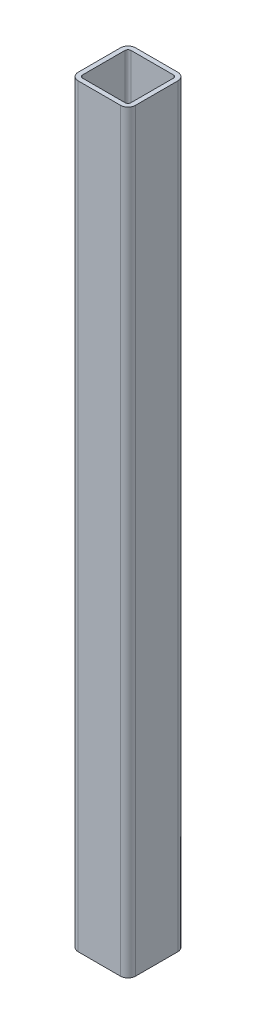
ISO-10303-21;
HEADER;
FILE_DESCRIPTION(('STEP AP214'),'2;1');
FILE_NAME('part.step','',(''),(''),'','','');
FILE_SCHEMA(('AUTOMOTIVE_DESIGN { 1 0 10303 214 1 1 1 1 }'));
ENDSEC;
DATA;
#1=APPLICATION_CONTEXT('core data for automotive mechanical design processes');
#2=APPLICATION_PROTOCOL_DEFINITION('international standard','automotive_design',2000,#1);
#3=PRODUCT_CONTEXT('',#1,'mechanical');
#4=PRODUCT('Part','Part','',(#3));
#5=PRODUCT_RELATED_PRODUCT_CATEGORY('part','',(#4));
#6=PRODUCT_DEFINITION_FORMATION('','',#4);
#7=PRODUCT_DEFINITION_CONTEXT('part definition',#1,'design');
#8=PRODUCT_DEFINITION('design','',#6,#7);
#9=PRODUCT_DEFINITION_SHAPE('','',#8);
#10=(LENGTH_UNIT() NAMED_UNIT(*) SI_UNIT(.MILLI.,.METRE.));
#11=(NAMED_UNIT(*) PLANE_ANGLE_UNIT() SI_UNIT($,.RADIAN.));
#12=(NAMED_UNIT(*) SI_UNIT($,.STERADIAN.) SOLID_ANGLE_UNIT());
#13=UNCERTAINTY_MEASURE_WITH_UNIT(LENGTH_MEASURE(1.E-05),#10,'distance_accuracy_value','');
#14=(GEOMETRIC_REPRESENTATION_CONTEXT(3) GLOBAL_UNCERTAINTY_ASSIGNED_CONTEXT((#13)) GLOBAL_UNIT_ASSIGNED_CONTEXT((#10,
#11,#12)) REPRESENTATION_CONTEXT('',''));
#15=CARTESIAN_POINT('',(0.,0.,0.));
#16=DIRECTION('',(0.,0.,1.));
#17=DIRECTION('',(1.,0.,0.));
#18=AXIS2_PLACEMENT_3D('',#15,#16,#17);
#19=CARTESIAN_POINT('',(0.,-250.,0.));
#20=DIRECTION('',(0.,-1.,0.));
#21=DIRECTION('',(0.,0.,-1.));
#22=AXIS2_PLACEMENT_3D('',#19,#20,#21);
#23=PLANE('',#22);
#24=DIRECTION('',(0.,0.,1.));
#25=VECTOR('',#24,1.);
#26=CARTESIAN_POINT('',(-19.,-250.,19.));
#27=LINE('',#26,#25);
#28=CARTESIAN_POINT('',(-19.,-250.,-14.));
#29=VERTEX_POINT('',#28);
#30=CARTESIAN_POINT('',(-19.,-250.,14.));
#31=VERTEX_POINT('',#30);
#32=EDGE_CURVE('E252',#29,#31,#27,.T.);
#33=ORIENTED_EDGE('',*,*,#32,.F.);
#34=CARTESIAN_POINT('',(-14.,-250.,-14.));
#35=DIRECTION('',(0.,-1.,0.));
#36=DIRECTION('',(0.,0.,-1.));
#37=AXIS2_PLACEMENT_3D('',#34,#35,#36);
#38=CIRCLE('',#37,5.);
#39=CARTESIAN_POINT('',(-14.,-250.,-19.));
#40=VERTEX_POINT('',#39);
#41=EDGE_CURVE('E274',#29,#40,#38,.T.);
#42=ORIENTED_EDGE('',*,*,#41,.T.);
#43=DIRECTION('',(-1.,0.,0.));
#44=VECTOR('',#43,1.);
#45=CARTESIAN_POINT('',(-19.,-250.,-19.));
#46=LINE('',#45,#44);
#47=CARTESIAN_POINT('',(14.,-250.,-19.));
#48=VERTEX_POINT('',#47);
#49=EDGE_CURVE('E247',#48,#40,#46,.T.);
#50=ORIENTED_EDGE('',*,*,#49,.F.);
#51=CARTESIAN_POINT('',(14.,-250.,-14.));
#52=DIRECTION('',(0.,-1.,0.));
#53=DIRECTION('',(0.,0.,-1.));
#54=AXIS2_PLACEMENT_3D('',#51,#52,#53);
#55=CIRCLE('',#54,5.);
#56=CARTESIAN_POINT('',(19.,-250.,-14.));
#57=VERTEX_POINT('',#56);
#58=EDGE_CURVE('E271',#48,#57,#55,.T.);
#59=ORIENTED_EDGE('',*,*,#58,.T.);
#60=DIRECTION('',(0.,0.,-1.));
#61=VECTOR('',#60,1.);
#62=CARTESIAN_POINT('',(19.,-250.,19.));
#63=LINE('',#62,#61);
#64=CARTESIAN_POINT('',(19.,-250.,14.));
#65=VERTEX_POINT('',#64);
#66=EDGE_CURVE('E243',#65,#57,#63,.T.);
#67=ORIENTED_EDGE('',*,*,#66,.F.);
#68=CARTESIAN_POINT('',(14.,-250.,14.));
#69=DIRECTION('',(0.,-1.,0.));
#70=DIRECTION('',(0.,0.,-1.));
#71=AXIS2_PLACEMENT_3D('',#68,#69,#70);
#72=CIRCLE('',#71,5.);
#73=CARTESIAN_POINT('',(14.,-250.,19.));
#74=VERTEX_POINT('',#73);
#75=EDGE_CURVE('E268',#65,#74,#72,.T.);
#76=ORIENTED_EDGE('',*,*,#75,.T.);
#77=DIRECTION('',(1.,0.,0.));
#78=VECTOR('',#77,1.);
#79=CARTESIAN_POINT('',(-19.,-250.,19.));
#80=LINE('',#79,#78);
#81=CARTESIAN_POINT('',(-14.,-250.,19.));
#82=VERTEX_POINT('',#81);
#83=EDGE_CURVE('E230',#82,#74,#80,.T.);
#84=ORIENTED_EDGE('',*,*,#83,.F.);
#85=CARTESIAN_POINT('',(-14.,-250.,14.));
#86=DIRECTION('',(0.,-1.,0.));
#87=DIRECTION('',(0.,0.,-1.));
#88=AXIS2_PLACEMENT_3D('',#85,#86,#87);
#89=CIRCLE('',#88,5.);
#90=EDGE_CURVE('E265',#82,#31,#89,.T.);
#91=ORIENTED_EDGE('',*,*,#90,.T.);
#92=EDGE_LOOP('',(#33,#42,#50,#59,#67,#76,#84,#91));
#93=FACE_BOUND('',#92,.T.);
#94=CARTESIAN_POINT('',(-14.,-250.,-14.));
#95=DIRECTION('',(0.,-1.,0.));
#96=DIRECTION('',(0.,0.,-1.));
#97=AXIS2_PLACEMENT_3D('',#94,#95,#96);
#98=CIRCLE('',#97,2.);
#99=CARTESIAN_POINT('',(-16.,-250.,-14.));
#100=VERTEX_POINT('',#99);
#101=CARTESIAN_POINT('',(-14.,-250.,-16.));
#102=VERTEX_POINT('',#101);
#103=EDGE_CURVE('E181',#100,#102,#98,.T.);
#104=ORIENTED_EDGE('',*,*,#103,.F.);
#105=DIRECTION('',(0.,0.,1.));
#106=VECTOR('',#105,1.);
#107=CARTESIAN_POINT('',(-16.,-250.,0.));
#108=LINE('',#107,#106);
#109=CARTESIAN_POINT('',(-16.,-250.,14.));
#110=VERTEX_POINT('',#109);
#111=EDGE_CURVE('E188',#100,#110,#108,.T.);
#112=ORIENTED_EDGE('',*,*,#111,.T.);
#113=CARTESIAN_POINT('',(-14.,-250.,14.));
#114=DIRECTION('',(0.,-1.,0.));
#115=DIRECTION('',(0.,0.,-1.));
#116=AXIS2_PLACEMENT_3D('',#113,#114,#115);
#117=CIRCLE('',#116,2.);
#118=CARTESIAN_POINT('',(-14.,-250.,16.));
#119=VERTEX_POINT('',#118);
#120=EDGE_CURVE('E177',#119,#110,#117,.T.);
#121=ORIENTED_EDGE('',*,*,#120,.F.);
#122=DIRECTION('',(1.,0.,0.));
#123=VECTOR('',#122,1.);
#124=CARTESIAN_POINT('',(0.,-250.,16.));
#125=LINE('',#124,#123);
#126=CARTESIAN_POINT('',(14.,-250.,16.));
#127=VERTEX_POINT('',#126);
#128=EDGE_CURVE('E63',#119,#127,#125,.T.);
#129=ORIENTED_EDGE('',*,*,#128,.T.);
#130=CARTESIAN_POINT('',(14.,-250.,14.));
#131=DIRECTION('',(0.,-1.,0.));
#132=DIRECTION('',(0.,0.,-1.));
#133=AXIS2_PLACEMENT_3D('',#130,#131,#132);
#134=CIRCLE('',#133,2.);
#135=CARTESIAN_POINT('',(16.,-250.,14.));
#136=VERTEX_POINT('',#135);
#137=EDGE_CURVE('E158',#136,#127,#134,.T.);
#138=ORIENTED_EDGE('',*,*,#137,.F.);
#139=DIRECTION('',(0.,0.,-1.));
#140=VECTOR('',#139,1.);
#141=CARTESIAN_POINT('',(16.,-250.,0.));
#142=LINE('',#141,#140);
#143=CARTESIAN_POINT('',(16.,-250.,-14.));
#144=VERTEX_POINT('',#143);
#145=EDGE_CURVE('E166',#136,#144,#142,.T.);
#146=ORIENTED_EDGE('',*,*,#145,.T.);
#147=CARTESIAN_POINT('',(14.,-250.,-14.));
#148=DIRECTION('',(0.,-1.,0.));
#149=DIRECTION('',(0.,0.,-1.));
#150=AXIS2_PLACEMENT_3D('',#147,#148,#149);
#151=CIRCLE('',#150,2.);
#152=CARTESIAN_POINT('',(14.,-250.,-16.));
#153=VERTEX_POINT('',#152);
#154=EDGE_CURVE('E176',#153,#144,#151,.T.);
#155=ORIENTED_EDGE('',*,*,#154,.F.);
#156=DIRECTION('',(-1.,0.,0.));
#157=VECTOR('',#156,1.);
#158=CARTESIAN_POINT('',(0.,-250.,-16.));
#159=LINE('',#158,#157);
#160=EDGE_CURVE('E171',#153,#102,#159,.T.);
#161=ORIENTED_EDGE('',*,*,#160,.T.);
#162=EDGE_LOOP('',(#104,#112,#121,#129,#138,#146,#155,#161));
#163=FACE_BOUND('',#162,.T.);
#164=ADVANCED_FACE('F39',(#93,#163),#23,.T.);
#165=CARTESIAN_POINT('',(19.,250.,19.));
#166=DIRECTION('',(-1.,0.,0.));
#167=DIRECTION('',(0.,0.,1.));
#168=AXIS2_PLACEMENT_3D('',#165,#166,#167);
#169=PLANE('',#168);
#170=ORIENTED_EDGE('',*,*,#66,.T.);
#171=DIRECTION('',(0.,-1.,0.));
#172=VECTOR('',#171,1.);
#173=CARTESIAN_POINT('',(19.,250.,-14.));
#174=LINE('',#173,#172);
#175=CARTESIAN_POINT('',(19.,250.,-14.));
#176=VERTEX_POINT('',#175);
#177=EDGE_CURVE('E300',#57,#176,#174,.F.);
#178=ORIENTED_EDGE('',*,*,#177,.T.);
#179=DIRECTION('',(0.,0.,-1.));
#180=VECTOR('',#179,1.);
#181=CARTESIAN_POINT('',(19.,250.,19.));
#182=LINE('',#181,#180);
#183=CARTESIAN_POINT('',(19.,250.,14.));
#184=VERTEX_POINT('',#183);
#185=EDGE_CURVE('E225',#184,#176,#182,.T.);
#186=ORIENTED_EDGE('',*,*,#185,.F.);
#187=DIRECTION('',(0.,-1.,0.));
#188=VECTOR('',#187,1.);
#189=CARTESIAN_POINT('',(19.,250.,14.));
#190=LINE('',#189,#188);
#191=EDGE_CURVE('E296',#184,#65,#190,.T.);
#192=ORIENTED_EDGE('',*,*,#191,.T.);
#193=EDGE_LOOP('',(#170,#178,#186,#192));
#194=FACE_BOUND('',#193,.T.);
#195=ADVANCED_FACE('F321',(#194),#169,.F.);
#196=CARTESIAN_POINT('',(-19.,250.,-19.));
#197=DIRECTION('',(0.,0.,1.));
#198=DIRECTION('',(1.,0.,0.));
#199=AXIS2_PLACEMENT_3D('',#196,#197,#198);
#200=PLANE('',#199);
#201=ORIENTED_EDGE('',*,*,#49,.T.);
#202=DIRECTION('',(0.,-1.,0.));
#203=VECTOR('',#202,1.);
#204=CARTESIAN_POINT('',(-14.,250.,-19.));
#205=LINE('',#204,#203);
#206=CARTESIAN_POINT('',(-14.,250.,-19.));
#207=VERTEX_POINT('',#206);
#208=EDGE_CURVE('E281',#40,#207,#205,.F.);
#209=ORIENTED_EDGE('',*,*,#208,.T.);
#210=DIRECTION('',(-1.,0.,0.));
#211=VECTOR('',#210,1.);
#212=CARTESIAN_POINT('',(-19.,250.,-19.));
#213=LINE('',#212,#211);
#214=CARTESIAN_POINT('',(14.,250.,-19.));
#215=VERTEX_POINT('',#214);
#216=EDGE_CURVE('E229',#215,#207,#213,.T.);
#217=ORIENTED_EDGE('',*,*,#216,.F.);
#218=DIRECTION('',(0.,-1.,0.));
#219=VECTOR('',#218,1.);
#220=CARTESIAN_POINT('',(14.,250.,-19.));
#221=LINE('',#220,#219);
#222=EDGE_CURVE('E277',#215,#48,#221,.T.);
#223=ORIENTED_EDGE('',*,*,#222,.T.);
#224=EDGE_LOOP('',(#201,#209,#217,#223));
#225=FACE_BOUND('',#224,.T.);
#226=ADVANCED_FACE('F332',(#225),#200,.F.);
#227=CARTESIAN_POINT('',(-19.,250.,19.));
#228=DIRECTION('',(1.,0.,0.));
#229=DIRECTION('',(0.,0.,-1.));
#230=AXIS2_PLACEMENT_3D('',#227,#228,#229);
#231=PLANE('',#230);
#232=DIRECTION('',(0.,0.,1.));
#233=VECTOR('',#232,1.);
#234=CARTESIAN_POINT('',(-19.,250.,19.));
#235=LINE('',#234,#233);
#236=CARTESIAN_POINT('',(-19.,250.,-14.));
#237=VERTEX_POINT('',#236);
#238=CARTESIAN_POINT('',(-19.,250.,14.));
#239=VERTEX_POINT('',#238);
#240=EDGE_CURVE('E234',#237,#239,#235,.T.);
#241=ORIENTED_EDGE('',*,*,#240,.F.);
#242=DIRECTION('',(0.,-1.,0.));
#243=VECTOR('',#242,1.);
#244=CARTESIAN_POINT('',(-19.,250.,-14.));
#245=LINE('',#244,#243);
#246=EDGE_CURVE('E261',#237,#29,#245,.T.);
#247=ORIENTED_EDGE('',*,*,#246,.T.);
#248=ORIENTED_EDGE('',*,*,#32,.T.);
#249=DIRECTION('',(0.,-1.,0.));
#250=VECTOR('',#249,1.);
#251=CARTESIAN_POINT('',(-19.,250.,14.));
#252=LINE('',#251,#250);
#253=EDGE_CURVE('E242',#31,#239,#252,.F.);
#254=ORIENTED_EDGE('',*,*,#253,.T.);
#255=EDGE_LOOP('',(#241,#247,#248,#254));
#256=FACE_BOUND('',#255,.T.);
#257=ADVANCED_FACE('F340',(#256),#231,.F.);
#258=CARTESIAN_POINT('',(-19.,250.,19.));
#259=DIRECTION('',(0.,0.,-1.));
#260=DIRECTION('',(-1.,0.,0.));
#261=AXIS2_PLACEMENT_3D('',#258,#259,#260);
#262=PLANE('',#261);
#263=ORIENTED_EDGE('',*,*,#83,.T.);
#264=DIRECTION('',(0.,-1.,0.));
#265=VECTOR('',#264,1.);
#266=CARTESIAN_POINT('',(14.,250.,19.));
#267=LINE('',#266,#265);
#268=CARTESIAN_POINT('',(14.,250.,19.));
#269=VERTEX_POINT('',#268);
#270=EDGE_CURVE('E11',#74,#269,#267,.F.);
#271=ORIENTED_EDGE('',*,*,#270,.T.);
#272=DIRECTION('',(1.,0.,0.));
#273=VECTOR('',#272,1.);
#274=CARTESIAN_POINT('',(-19.,250.,19.));
#275=LINE('',#274,#273);
#276=CARTESIAN_POINT('',(-14.,250.,19.));
#277=VERTEX_POINT('',#276);
#278=EDGE_CURVE('E238',#277,#269,#275,.T.);
#279=ORIENTED_EDGE('',*,*,#278,.F.);
#280=DIRECTION('',(0.,-1.,0.));
#281=VECTOR('',#280,1.);
#282=CARTESIAN_POINT('',(-14.,250.,19.));
#283=LINE('',#282,#281);
#284=EDGE_CURVE('E48',#277,#82,#283,.T.);
#285=ORIENTED_EDGE('',*,*,#284,.T.);
#286=EDGE_LOOP('',(#263,#271,#279,#285));
#287=FACE_BOUND('',#286,.T.);
#288=ADVANCED_FACE('F308',(#287),#262,.F.);
#289=CARTESIAN_POINT('',(0.,250.,0.));
#290=DIRECTION('',(0.,-1.,0.));
#291=DIRECTION('',(0.,0.,-1.));
#292=AXIS2_PLACEMENT_3D('',#289,#290,#291);
#293=PLANE('',#292);
#294=DIRECTION('',(-1.,0.,0.));
#295=VECTOR('',#294,1.);
#296=CARTESIAN_POINT('',(0.,250.,-16.));
#297=LINE('',#296,#295);
#298=CARTESIAN_POINT('',(14.,250.,-16.));
#299=VERTEX_POINT('',#298);
#300=CARTESIAN_POINT('',(-14.,250.,-16.));
#301=VERTEX_POINT('',#300);
#302=EDGE_CURVE('E201',#299,#301,#297,.T.);
#303=ORIENTED_EDGE('',*,*,#302,.F.);
#304=CARTESIAN_POINT('',(14.,250.,-14.));
#305=DIRECTION('',(0.,-1.,0.));
#306=DIRECTION('',(0.,0.,-1.));
#307=AXIS2_PLACEMENT_3D('',#304,#305,#306);
#308=CIRCLE('',#307,2.);
#309=CARTESIAN_POINT('',(16.,250.,-14.));
#310=VERTEX_POINT('',#309);
#311=EDGE_CURVE('E202',#310,#299,#308,.F.);
#312=ORIENTED_EDGE('',*,*,#311,.F.);
#313=DIRECTION('',(0.,0.,-1.));
#314=VECTOR('',#313,1.);
#315=CARTESIAN_POINT('',(16.,250.,0.));
#316=LINE('',#315,#314);
#317=CARTESIAN_POINT('',(16.,250.,14.));
#318=VERTEX_POINT('',#317);
#319=EDGE_CURVE('E55',#318,#310,#316,.T.);
#320=ORIENTED_EDGE('',*,*,#319,.F.);
#321=CARTESIAN_POINT('',(14.,250.,14.));
#322=DIRECTION('',(0.,-1.,0.));
#323=DIRECTION('',(0.,0.,-1.));
#324=AXIS2_PLACEMENT_3D('',#321,#322,#323);
#325=CIRCLE('',#324,2.);
#326=CARTESIAN_POINT('',(14.,250.,16.));
#327=VERTEX_POINT('',#326);
#328=EDGE_CURVE('E160',#327,#318,#325,.F.);
#329=ORIENTED_EDGE('',*,*,#328,.F.);
#330=DIRECTION('',(1.,0.,0.));
#331=VECTOR('',#330,1.);
#332=CARTESIAN_POINT('',(0.,250.,16.));
#333=LINE('',#332,#331);
#334=CARTESIAN_POINT('',(-14.,250.,16.));
#335=VERTEX_POINT('',#334);
#336=EDGE_CURVE('E214',#335,#327,#333,.T.);
#337=ORIENTED_EDGE('',*,*,#336,.F.);
#338=CARTESIAN_POINT('',(-14.,250.,14.));
#339=DIRECTION('',(0.,-1.,0.));
#340=DIRECTION('',(0.,0.,-1.));
#341=AXIS2_PLACEMENT_3D('',#338,#339,#340);
#342=CIRCLE('',#341,2.);
#343=CARTESIAN_POINT('',(-16.,250.,14.));
#344=VERTEX_POINT('',#343);
#345=EDGE_CURVE('E215',#344,#335,#342,.F.);
#346=ORIENTED_EDGE('',*,*,#345,.F.);
#347=DIRECTION('',(0.,0.,1.));
#348=VECTOR('',#347,1.);
#349=CARTESIAN_POINT('',(-16.,250.,0.));
#350=LINE('',#349,#348);
#351=CARTESIAN_POINT('',(-16.,250.,-14.));
#352=VERTEX_POINT('',#351);
#353=EDGE_CURVE('E208',#352,#344,#350,.T.);
#354=ORIENTED_EDGE('',*,*,#353,.F.);
#355=CARTESIAN_POINT('',(-14.,250.,-14.));
#356=DIRECTION('',(0.,-1.,0.));
#357=DIRECTION('',(0.,0.,-1.));
#358=AXIS2_PLACEMENT_3D('',#355,#356,#357);
#359=CIRCLE('',#358,2.);
#360=EDGE_CURVE('E163',#301,#352,#359,.F.);
#361=ORIENTED_EDGE('',*,*,#360,.F.);
#362=EDGE_LOOP('',(#303,#312,#320,#329,#337,#346,#354,#361));
#363=FACE_BOUND('',#362,.T.);
#364=ORIENTED_EDGE('',*,*,#216,.T.);
#365=CARTESIAN_POINT('',(-14.,250.,-14.));
#366=DIRECTION('',(0.,-1.,0.));
#367=DIRECTION('',(0.,0.,-1.));
#368=AXIS2_PLACEMENT_3D('',#365,#366,#367);
#369=CIRCLE('',#368,5.);
#370=EDGE_CURVE('E293',#207,#237,#369,.F.);
#371=ORIENTED_EDGE('',*,*,#370,.T.);
#372=ORIENTED_EDGE('',*,*,#240,.T.);
#373=CARTESIAN_POINT('',(-14.,250.,14.));
#374=DIRECTION('',(0.,-1.,0.));
#375=DIRECTION('',(0.,0.,-1.));
#376=AXIS2_PLACEMENT_3D('',#373,#374,#375);
#377=CIRCLE('',#376,5.);
#378=EDGE_CURVE('E284',#239,#277,#377,.F.);
#379=ORIENTED_EDGE('',*,*,#378,.T.);
#380=ORIENTED_EDGE('',*,*,#278,.T.);
#381=CARTESIAN_POINT('',(14.,250.,14.));
#382=DIRECTION('',(0.,-1.,0.));
#383=DIRECTION('',(0.,0.,-1.));
#384=AXIS2_PLACEMENT_3D('',#381,#382,#383);
#385=CIRCLE('',#384,5.);
#386=EDGE_CURVE('E287',#269,#184,#385,.F.);
#387=ORIENTED_EDGE('',*,*,#386,.T.);
#388=ORIENTED_EDGE('',*,*,#185,.T.);
#389=CARTESIAN_POINT('',(14.,250.,-14.));
#390=DIRECTION('',(0.,-1.,0.));
#391=DIRECTION('',(0.,0.,-1.));
#392=AXIS2_PLACEMENT_3D('',#389,#390,#391);
#393=CIRCLE('',#392,5.);
#394=EDGE_CURVE('E290',#176,#215,#393,.F.);
#395=ORIENTED_EDGE('',*,*,#394,.T.);
#396=EDGE_LOOP('',(#364,#371,#372,#379,#380,#387,#388,#395));
#397=FACE_BOUND('',#396,.T.);
#398=ADVANCED_FACE('F325',(#363,#397),#293,.F.);
#399=CARTESIAN_POINT('',(-14.,250.,-14.));
#400=DIRECTION('',(0.,-1.,0.));
#401=DIRECTION('',(0.,0.,-1.));
#402=AXIS2_PLACEMENT_3D('',#399,#400,#401);
#403=CYLINDRICAL_SURFACE('',#402,5.);
#404=ORIENTED_EDGE('',*,*,#370,.F.);
#405=ORIENTED_EDGE('',*,*,#208,.F.);
#406=ORIENTED_EDGE('',*,*,#41,.F.);
#407=ORIENTED_EDGE('',*,*,#246,.F.);
#408=EDGE_LOOP('',(#404,#405,#406,#407));
#409=FACE_BOUND('',#408,.T.);
#410=ADVANCED_FACE('F337',(#409),#403,.T.);
#411=CARTESIAN_POINT('',(14.,250.,-14.));
#412=DIRECTION('',(0.,-1.,0.));
#413=DIRECTION('',(0.,0.,-1.));
#414=AXIS2_PLACEMENT_3D('',#411,#412,#413);
#415=CYLINDRICAL_SURFACE('',#414,5.);
#416=ORIENTED_EDGE('',*,*,#394,.F.);
#417=ORIENTED_EDGE('',*,*,#177,.F.);
#418=ORIENTED_EDGE('',*,*,#58,.F.);
#419=ORIENTED_EDGE('',*,*,#222,.F.);
#420=EDGE_LOOP('',(#416,#417,#418,#419));
#421=FACE_BOUND('',#420,.T.);
#422=ADVANCED_FACE('F329',(#421),#415,.T.);
#423=CARTESIAN_POINT('',(14.,250.,14.));
#424=DIRECTION('',(0.,-1.,0.));
#425=DIRECTION('',(0.,0.,-1.));
#426=AXIS2_PLACEMENT_3D('',#423,#424,#425);
#427=CYLINDRICAL_SURFACE('',#426,5.);
#428=ORIENTED_EDGE('',*,*,#386,.F.);
#429=ORIENTED_EDGE('',*,*,#270,.F.);
#430=ORIENTED_EDGE('',*,*,#75,.F.);
#431=ORIENTED_EDGE('',*,*,#191,.F.);
#432=EDGE_LOOP('',(#428,#429,#430,#431));
#433=FACE_BOUND('',#432,.T.);
#434=ADVANCED_FACE('F318',(#433),#427,.T.);
#435=CARTESIAN_POINT('',(-14.,250.,14.));
#436=DIRECTION('',(0.,-1.,0.));
#437=DIRECTION('',(0.,0.,-1.));
#438=AXIS2_PLACEMENT_3D('',#435,#436,#437);
#439=CYLINDRICAL_SURFACE('',#438,5.);
#440=ORIENTED_EDGE('',*,*,#378,.F.);
#441=ORIENTED_EDGE('',*,*,#253,.F.);
#442=ORIENTED_EDGE('',*,*,#90,.F.);
#443=ORIENTED_EDGE('',*,*,#284,.F.);
#444=EDGE_LOOP('',(#440,#441,#442,#443));
#445=FACE_BOUND('',#444,.T.);
#446=ADVANCED_FACE('F41',(#445),#439,.T.);
#447=CARTESIAN_POINT('',(16.,250.,19.));
#448=DIRECTION('',(-1.,0.,0.));
#449=DIRECTION('',(0.,0.,1.));
#450=AXIS2_PLACEMENT_3D('',#447,#448,#449);
#451=PLANE('',#450);
#452=ORIENTED_EDGE('',*,*,#145,.F.);
#453=DIRECTION('',(0.,1.,0.));
#454=VECTOR('',#453,1.);
#455=CARTESIAN_POINT('',(16.,250.,14.));
#456=LINE('',#455,#454);
#457=EDGE_CURVE('E154',#318,#136,#456,.F.);
#458=ORIENTED_EDGE('',*,*,#457,.F.);
#459=ORIENTED_EDGE('',*,*,#319,.T.);
#460=DIRECTION('',(0.,1.,0.));
#461=VECTOR('',#460,1.);
#462=CARTESIAN_POINT('',(16.,250.,-14.));
#463=LINE('',#462,#461);
#464=EDGE_CURVE('E162',#144,#310,#463,.T.);
#465=ORIENTED_EDGE('',*,*,#464,.F.);
#466=EDGE_LOOP('',(#452,#458,#459,#465));
#467=FACE_BOUND('',#466,.T.);
#468=ADVANCED_FACE('F167',(#467),#451,.T.);
#469=CARTESIAN_POINT('',(-19.,250.,-16.));
#470=DIRECTION('',(0.,0.,1.));
#471=DIRECTION('',(1.,0.,0.));
#472=AXIS2_PLACEMENT_3D('',#469,#470,#471);
#473=PLANE('',#472);
#474=ORIENTED_EDGE('',*,*,#160,.F.);
#475=DIRECTION('',(0.,1.,0.));
#476=VECTOR('',#475,1.);
#477=CARTESIAN_POINT('',(14.,250.,-16.));
#478=LINE('',#477,#476);
#479=EDGE_CURVE('E195',#299,#153,#478,.F.);
#480=ORIENTED_EDGE('',*,*,#479,.F.);
#481=ORIENTED_EDGE('',*,*,#302,.T.);
#482=DIRECTION('',(0.,1.,0.));
#483=VECTOR('',#482,1.);
#484=CARTESIAN_POINT('',(-14.,250.,-16.));
#485=LINE('',#484,#483);
#486=EDGE_CURVE('E218',#102,#301,#485,.T.);
#487=ORIENTED_EDGE('',*,*,#486,.F.);
#488=EDGE_LOOP('',(#474,#480,#481,#487));
#489=FACE_BOUND('',#488,.T.);
#490=ADVANCED_FACE('F347',(#489),#473,.T.);
#491=CARTESIAN_POINT('',(-16.,250.,19.));
#492=DIRECTION('',(1.,0.,0.));
#493=DIRECTION('',(0.,0.,-1.));
#494=AXIS2_PLACEMENT_3D('',#491,#492,#493);
#495=PLANE('',#494);
#496=ORIENTED_EDGE('',*,*,#353,.T.);
#497=DIRECTION('',(0.,1.,0.));
#498=VECTOR('',#497,1.);
#499=CARTESIAN_POINT('',(-16.,250.,14.));
#500=LINE('',#499,#498);
#501=EDGE_CURVE('E222',#110,#344,#500,.T.);
#502=ORIENTED_EDGE('',*,*,#501,.F.);
#503=ORIENTED_EDGE('',*,*,#111,.F.);
#504=DIRECTION('',(0.,1.,0.));
#505=VECTOR('',#504,1.);
#506=CARTESIAN_POINT('',(-16.,250.,-14.));
#507=LINE('',#506,#505);
#508=EDGE_CURVE('E183',#352,#100,#507,.F.);
#509=ORIENTED_EDGE('',*,*,#508,.F.);
#510=EDGE_LOOP('',(#496,#502,#503,#509));
#511=FACE_BOUND('',#510,.T.);
#512=ADVANCED_FACE('F408',(#511),#495,.T.);
#513=CARTESIAN_POINT('',(-19.,250.,16.));
#514=DIRECTION('',(0.,0.,-1.));
#515=DIRECTION('',(-1.,0.,0.));
#516=AXIS2_PLACEMENT_3D('',#513,#514,#515);
#517=PLANE('',#516);
#518=ORIENTED_EDGE('',*,*,#128,.F.);
#519=DIRECTION('',(0.,1.,0.));
#520=VECTOR('',#519,1.);
#521=CARTESIAN_POINT('',(-14.,250.,16.));
#522=LINE('',#521,#520);
#523=EDGE_CURVE('E469',#335,#119,#522,.F.);
#524=ORIENTED_EDGE('',*,*,#523,.F.);
#525=ORIENTED_EDGE('',*,*,#336,.T.);
#526=DIRECTION('',(0.,1.,0.));
#527=VECTOR('',#526,1.);
#528=CARTESIAN_POINT('',(14.,250.,16.));
#529=LINE('',#528,#527);
#530=EDGE_CURVE('E248',#127,#327,#529,.T.);
#531=ORIENTED_EDGE('',*,*,#530,.F.);
#532=EDGE_LOOP('',(#518,#524,#525,#531));
#533=FACE_BOUND('',#532,.T.);
#534=ADVANCED_FACE('F418',(#533),#517,.T.);
#535=CARTESIAN_POINT('',(-14.,250.,-14.));
#536=DIRECTION('',(0.,-1.,0.));
#537=DIRECTION('',(0.,0.,-1.));
#538=AXIS2_PLACEMENT_3D('',#535,#536,#537);
#539=CYLINDRICAL_SURFACE('',#538,2.);
#540=ORIENTED_EDGE('',*,*,#360,.T.);
#541=ORIENTED_EDGE('',*,*,#508,.T.);
#542=ORIENTED_EDGE('',*,*,#103,.T.);
#543=ORIENTED_EDGE('',*,*,#486,.T.);
#544=EDGE_LOOP('',(#540,#541,#542,#543));
#545=FACE_BOUND('',#544,.T.);
#546=ADVANCED_FACE('F428',(#545),#539,.F.);
#547=CARTESIAN_POINT('',(14.,250.,-14.));
#548=DIRECTION('',(0.,-1.,0.));
#549=DIRECTION('',(0.,0.,-1.));
#550=AXIS2_PLACEMENT_3D('',#547,#548,#549);
#551=CYLINDRICAL_SURFACE('',#550,2.);
#552=ORIENTED_EDGE('',*,*,#311,.T.);
#553=ORIENTED_EDGE('',*,*,#479,.T.);
#554=ORIENTED_EDGE('',*,*,#154,.T.);
#555=ORIENTED_EDGE('',*,*,#464,.T.);
#556=EDGE_LOOP('',(#552,#553,#554,#555));
#557=FACE_BOUND('',#556,.T.);
#558=ADVANCED_FACE('F437',(#557),#551,.F.);
#559=CARTESIAN_POINT('',(14.,250.,14.));
#560=DIRECTION('',(0.,-1.,0.));
#561=DIRECTION('',(0.,0.,-1.));
#562=AXIS2_PLACEMENT_3D('',#559,#560,#561);
#563=CYLINDRICAL_SURFACE('',#562,2.);
#564=ORIENTED_EDGE('',*,*,#328,.T.);
#565=ORIENTED_EDGE('',*,*,#457,.T.);
#566=ORIENTED_EDGE('',*,*,#137,.T.);
#567=ORIENTED_EDGE('',*,*,#530,.T.);
#568=EDGE_LOOP('',(#564,#565,#566,#567));
#569=FACE_BOUND('',#568,.T.);
#570=ADVANCED_FACE('F156',(#569),#563,.F.);
#571=CARTESIAN_POINT('',(-14.,250.,14.));
#572=DIRECTION('',(0.,-1.,0.));
#573=DIRECTION('',(0.,0.,-1.));
#574=AXIS2_PLACEMENT_3D('',#571,#572,#573);
#575=CYLINDRICAL_SURFACE('',#574,2.);
#576=ORIENTED_EDGE('',*,*,#345,.T.);
#577=ORIENTED_EDGE('',*,*,#523,.T.);
#578=ORIENTED_EDGE('',*,*,#120,.T.);
#579=ORIENTED_EDGE('',*,*,#501,.T.);
#580=EDGE_LOOP('',(#576,#577,#578,#579));
#581=FACE_BOUND('',#580,.T.);
#582=ADVANCED_FACE('F456',(#581),#575,.F.);
#583=CLOSED_SHELL('',(#164,#195,#226,#257,#288,#398,#410,#422,#434,#446,#468,#490,#512,#534,
#546,#558,#570,#582));
#584=MANIFOLD_SOLID_BREP('B2',#583);
#585=ADVANCED_BREP_SHAPE_REPRESENTATION('',(#18,#584),#14);
#586=SHAPE_DEFINITION_REPRESENTATION(#9,#585);
ENDSEC;
END-ISO-10303-21;
